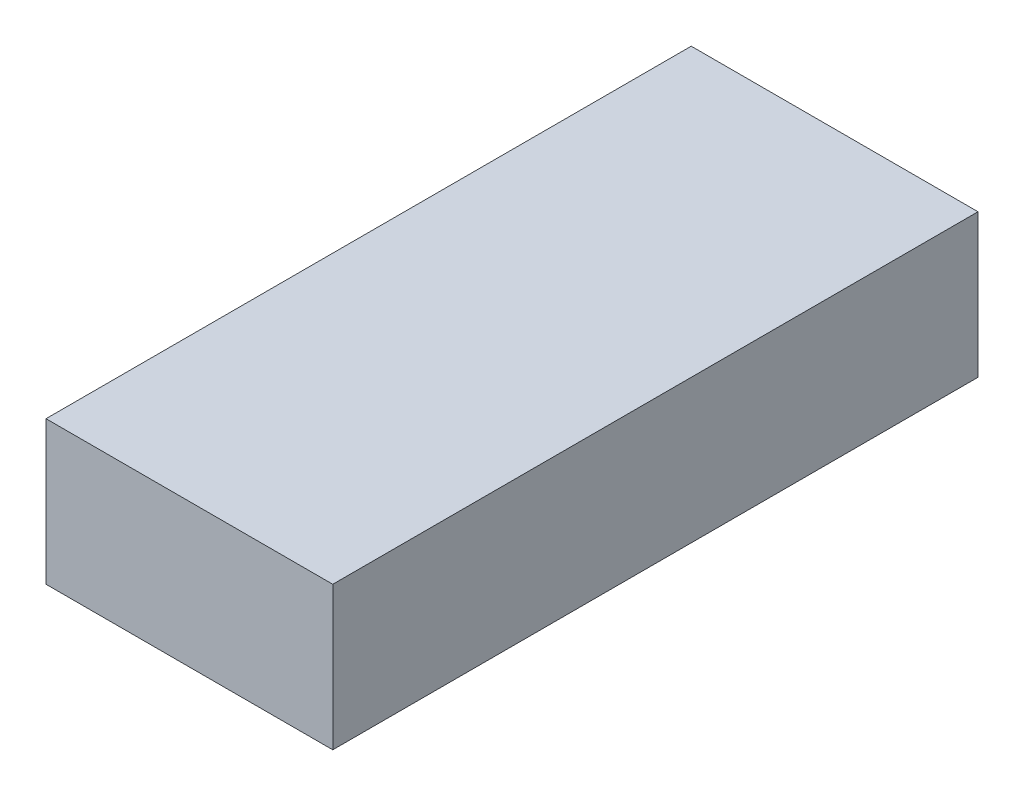
ISO-10303-21;
HEADER;
FILE_DESCRIPTION(('STEP AP214'),'2;1');
FILE_NAME('part.step','',(''),(''),'','','');
FILE_SCHEMA(('AUTOMOTIVE_DESIGN { 1 0 10303 214 1 1 1 1 }'));
ENDSEC;
DATA;
#1=APPLICATION_CONTEXT('core data for automotive mechanical design processes');
#2=APPLICATION_PROTOCOL_DEFINITION('international standard','automotive_design',2000,#1);
#3=PRODUCT_CONTEXT('',#1,'mechanical');
#4=PRODUCT('Part','Part','',(#3));
#5=PRODUCT_RELATED_PRODUCT_CATEGORY('part','',(#4));
#6=PRODUCT_DEFINITION_FORMATION('','',#4);
#7=PRODUCT_DEFINITION_CONTEXT('part definition',#1,'design');
#8=PRODUCT_DEFINITION('design','',#6,#7);
#9=PRODUCT_DEFINITION_SHAPE('','',#8);
#10=(LENGTH_UNIT() NAMED_UNIT(*) SI_UNIT(.MILLI.,.METRE.));
#11=(NAMED_UNIT(*) PLANE_ANGLE_UNIT() SI_UNIT($,.RADIAN.));
#12=(NAMED_UNIT(*) SI_UNIT($,.STERADIAN.) SOLID_ANGLE_UNIT());
#13=UNCERTAINTY_MEASURE_WITH_UNIT(LENGTH_MEASURE(1.E-05),#10,'distance_accuracy_value','');
#14=(GEOMETRIC_REPRESENTATION_CONTEXT(3) GLOBAL_UNCERTAINTY_ASSIGNED_CONTEXT((#13)) GLOBAL_UNIT_ASSIGNED_CONTEXT((#10,
#11,#12)) REPRESENTATION_CONTEXT('',''));
#15=CARTESIAN_POINT('',(0.,0.,0.));
#16=DIRECTION('',(0.,0.,1.));
#17=DIRECTION('',(1.,0.,0.));
#18=AXIS2_PLACEMENT_3D('',#15,#16,#17);
#19=CARTESIAN_POINT('',(-380.,10.,1700.));
#20=DIRECTION('',(0.,-1.,0.));
#21=DIRECTION('',(0.,0.,-1.));
#22=AXIS2_PLACEMENT_3D('',#19,#20,#21);
#23=PLANE('',#22);
#24=DIRECTION('',(0.,0.,-1.));
#25=VECTOR('',#24,1.);
#26=CARTESIAN_POINT('',(132.679491924311,10.,80.));
#27=LINE('',#26,#25);
#28=CARTESIAN_POINT('',(132.679491924311,9.99999999999999,0.));
#29=VERTEX_POINT('',#28);
#30=CARTESIAN_POINT('',(132.679491924311,10.,50.));
#31=VERTEX_POINT('',#30);
#32=EDGE_CURVE('E56',#29,#31,#27,.F.);
#33=ORIENTED_EDGE('',*,*,#32,.F.);
#34=DIRECTION('',(-1.,0.,0.));
#35=VECTOR('',#34,1.);
#36=CARTESIAN_POINT('',(-380.,10.,0.));
#37=LINE('',#36,#35);
#38=CARTESIAN_POINT('',(-132.679491924311,10.,0.));
#39=VERTEX_POINT('',#38);
#40=EDGE_CURVE('E192',#29,#39,#37,.T.);
#41=ORIENTED_EDGE('',*,*,#40,.T.);
#42=DIRECTION('',(0.,0.,-1.));
#43=VECTOR('',#42,1.);
#44=CARTESIAN_POINT('',(-132.679491924311,10.,80.));
#45=LINE('',#44,#43);
#46=CARTESIAN_POINT('',(-132.679491924311,10.,50.));
#47=VERTEX_POINT('',#46);
#48=EDGE_CURVE('E220',#47,#39,#45,.T.);
#49=ORIENTED_EDGE('',*,*,#48,.F.);
#50=DIRECTION('',(-1.,0.,0.));
#51=VECTOR('',#50,1.);
#52=CARTESIAN_POINT('',(0.,10.,50.));
#53=LINE('',#52,#51);
#54=EDGE_CURVE('E259',#31,#47,#53,.T.);
#55=ORIENTED_EDGE('',*,*,#54,.F.);
#56=EDGE_LOOP('',(#33,#41,#49,#55));
#57=FACE_BOUND('',#56,.T.);
#58=ADVANCED_FACE('F41',(#57),#23,.F.);
#59=DIRECTION('',(0.,0.,-1.));
#60=VECTOR('',#59,1.);
#61=CARTESIAN_POINT('',(167.320508075689,10.,80.));
#62=LINE('',#61,#60);
#63=CARTESIAN_POINT('',(167.320508075689,10.,50.));
#64=VERTEX_POINT('',#63);
#65=CARTESIAN_POINT('',(167.320508075689,9.99999999999999,0.));
#66=VERTEX_POINT('',#65);
#67=EDGE_CURVE('E176',#64,#66,#62,.T.);
#68=ORIENTED_EDGE('',*,*,#67,.F.);
#69=CARTESIAN_POINT('',(380.,9.99999999999995,50.));
#70=VERTEX_POINT('',#69);
#71=EDGE_CURVE('E260',#70,#64,#53,.T.);
#72=ORIENTED_EDGE('',*,*,#71,.F.);
#73=DIRECTION('',(0.,0.,-1.));
#74=VECTOR('',#73,1.);
#75=CARTESIAN_POINT('',(380.,10.,1700.));
#76=LINE('',#75,#74);
#77=CARTESIAN_POINT('',(380.,9.99999999999995,0.));
#78=VERTEX_POINT('',#77);
#79=EDGE_CURVE('E199',#70,#78,#76,.T.);
#80=ORIENTED_EDGE('',*,*,#79,.T.);
#81=EDGE_CURVE('E189',#78,#66,#37,.T.);
#82=ORIENTED_EDGE('',*,*,#81,.T.);
#83=EDGE_LOOP('',(#68,#72,#80,#82));
#84=FACE_BOUND('',#83,.T.);
#85=ADVANCED_FACE('F197',(#84),#23,.F.);
#86=CARTESIAN_POINT('',(-380.,-10.,1700.));
#87=DIRECTION('',(0.,1.,0.));
#88=DIRECTION('',(0.,0.,1.));
#89=AXIS2_PLACEMENT_3D('',#86,#87,#88);
#90=PLANE('',#89);
#91=DIRECTION('',(0.,0.,-1.));
#92=VECTOR('',#91,1.);
#93=CARTESIAN_POINT('',(167.320508075689,-10.,80.));
#94=LINE('',#93,#92);
#95=CARTESIAN_POINT('',(167.320508075689,-9.99999999999999,0.));
#96=VERTEX_POINT('',#95);
#97=CARTESIAN_POINT('',(167.320508075689,-10.,50.));
#98=VERTEX_POINT('',#97);
#99=EDGE_CURVE('E64',#96,#98,#94,.F.);
#100=ORIENTED_EDGE('',*,*,#99,.F.);
#101=DIRECTION('',(1.,0.,0.));
#102=VECTOR('',#101,1.);
#103=CARTESIAN_POINT('',(-380.,-10.,0.));
#104=LINE('',#103,#102);
#105=CARTESIAN_POINT('',(380.,-10.0000000000001,0.));
#106=VERTEX_POINT('',#105);
#107=EDGE_CURVE('E200',#96,#106,#104,.T.);
#108=ORIENTED_EDGE('',*,*,#107,.T.);
#109=DIRECTION('',(0.,0.,-1.));
#110=VECTOR('',#109,1.);
#111=CARTESIAN_POINT('',(380.,-10.,1700.));
#112=LINE('',#111,#110);
#113=CARTESIAN_POINT('',(380.,-10.0000000000001,50.));
#114=VERTEX_POINT('',#113);
#115=EDGE_CURVE('E211',#114,#106,#112,.T.);
#116=ORIENTED_EDGE('',*,*,#115,.F.);
#117=DIRECTION('',(1.,0.,0.));
#118=VECTOR('',#117,1.);
#119=CARTESIAN_POINT('',(0.,-10.,50.));
#120=LINE('',#119,#118);
#121=EDGE_CURVE('E239',#98,#114,#120,.T.);
#122=ORIENTED_EDGE('',*,*,#121,.F.);
#123=EDGE_LOOP('',(#100,#108,#116,#122));
#124=FACE_BOUND('',#123,.T.);
#125=ADVANCED_FACE('F246',(#124),#90,.F.);
#126=DIRECTION('',(0.,0.,-1.));
#127=VECTOR('',#126,1.);
#128=CARTESIAN_POINT('',(132.679491924311,-10.,80.));
#129=LINE('',#128,#127);
#130=CARTESIAN_POINT('',(132.679491924311,-10.,50.));
#131=VERTEX_POINT('',#130);
#132=CARTESIAN_POINT('',(132.679491924311,-9.99999999999999,0.));
#133=VERTEX_POINT('',#132);
#134=EDGE_CURVE('E232',#131,#133,#129,.T.);
#135=ORIENTED_EDGE('',*,*,#134,.F.);
#136=CARTESIAN_POINT('',(-132.679491924311,-10.,50.));
#137=VERTEX_POINT('',#136);
#138=EDGE_CURVE('E242',#137,#131,#120,.T.);
#139=ORIENTED_EDGE('',*,*,#138,.F.);
#140=DIRECTION('',(0.,0.,-1.));
#141=VECTOR('',#140,1.);
#142=CARTESIAN_POINT('',(-132.679491924311,-10.,80.));
#143=LINE('',#142,#141);
#144=CARTESIAN_POINT('',(-132.679491924311,-10.,0.));
#145=VERTEX_POINT('',#144);
#146=EDGE_CURVE('E11',#145,#137,#143,.F.);
#147=ORIENTED_EDGE('',*,*,#146,.F.);
#148=EDGE_CURVE('E203',#145,#133,#104,.T.);
#149=ORIENTED_EDGE('',*,*,#148,.T.);
#150=EDGE_LOOP('',(#135,#139,#147,#149));
#151=FACE_BOUND('',#150,.T.);
#152=ADVANCED_FACE('F278',(#151),#90,.F.);
#153=DIRECTION('',(0.,0.,-1.));
#154=VECTOR('',#153,1.);
#155=CARTESIAN_POINT('',(-167.320508075689,10.,80.));
#156=LINE('',#155,#154);
#157=CARTESIAN_POINT('',(-167.320508075689,10.,0.));
#158=VERTEX_POINT('',#157);
#159=CARTESIAN_POINT('',(-167.320508075689,10.,50.));
#160=VERTEX_POINT('',#159);
#161=EDGE_CURVE('E213',#158,#160,#156,.F.);
#162=ORIENTED_EDGE('',*,*,#161,.F.);
#163=CARTESIAN_POINT('',(-380.,10.,0.));
#164=VERTEX_POINT('',#163);
#165=EDGE_CURVE('E202',#158,#164,#37,.T.);
#166=ORIENTED_EDGE('',*,*,#165,.T.);
#167=DIRECTION('',(0.,0.,-1.));
#168=VECTOR('',#167,1.);
#169=CARTESIAN_POINT('',(-380.,10.,1700.));
#170=LINE('',#169,#168);
#171=CARTESIAN_POINT('',(-380.,10.,50.));
#172=VERTEX_POINT('',#171);
#173=EDGE_CURVE('E584',#172,#164,#170,.T.);
#174=ORIENTED_EDGE('',*,*,#173,.F.);
#175=EDGE_CURVE('E256',#160,#172,#53,.T.);
#176=ORIENTED_EDGE('',*,*,#175,.F.);
#177=EDGE_LOOP('',(#162,#166,#174,#176));
#178=FACE_BOUND('',#177,.T.);
#179=ADVANCED_FACE('F293',(#178),#23,.F.);
#180=DIRECTION('',(0.,0.,-1.));
#181=VECTOR('',#180,1.);
#182=CARTESIAN_POINT('',(-167.320508075689,-10.,80.));
#183=LINE('',#182,#181);
#184=CARTESIAN_POINT('',(-167.320508075689,-10.,50.));
#185=VERTEX_POINT('',#184);
#186=CARTESIAN_POINT('',(-167.320508075689,-10.,0.));
#187=VERTEX_POINT('',#186);
#188=EDGE_CURVE('E49',#185,#187,#183,.T.);
#189=ORIENTED_EDGE('',*,*,#188,.F.);
#190=CARTESIAN_POINT('',(-380.,-10.,50.));
#191=VERTEX_POINT('',#190);
#192=EDGE_CURVE('E250',#191,#185,#120,.T.);
#193=ORIENTED_EDGE('',*,*,#192,.F.);
#194=DIRECTION('',(0.,0.,-1.));
#195=VECTOR('',#194,1.);
#196=CARTESIAN_POINT('',(-380.,-10.,1700.));
#197=LINE('',#196,#195);
#198=CARTESIAN_POINT('',(-380.,-10.,0.));
#199=VERTEX_POINT('',#198);
#200=EDGE_CURVE('E571',#191,#199,#197,.T.);
#201=ORIENTED_EDGE('',*,*,#200,.T.);
#202=EDGE_CURVE('E205',#199,#187,#104,.T.);
#203=ORIENTED_EDGE('',*,*,#202,.T.);
#204=EDGE_LOOP('',(#189,#193,#201,#203));
#205=FACE_BOUND('',#204,.T.);
#206=ADVANCED_FACE('F300',(#205),#90,.F.);
#207=CARTESIAN_POINT('',(0.,0.,50.));
#208=DIRECTION('',(0.,0.,-1.));
#209=DIRECTION('',(-1.,0.,0.));
#210=AXIS2_PLACEMENT_3D('',#207,#208,#209);
#211=PLANE('',#210);
#212=ORIENTED_EDGE('',*,*,#71,.T.);
#213=CARTESIAN_POINT('',(150.,0.,50.));
#214=DIRECTION('',(0.,0.,-1.));
#215=DIRECTION('',(-1.,0.,0.));
#216=AXIS2_PLACEMENT_3D('',#213,#214,#215);
#217=CIRCLE('',#216,20.);
#218=EDGE_CURVE('E180',#64,#31,#217,.F.);
#219=ORIENTED_EDGE('',*,*,#218,.T.);
#220=ORIENTED_EDGE('',*,*,#54,.T.);
#221=CARTESIAN_POINT('',(-150.,0.,50.));
#222=DIRECTION('',(0.,0.,-1.));
#223=DIRECTION('',(-1.,0.,0.));
#224=AXIS2_PLACEMENT_3D('',#221,#222,#223);
#225=CIRCLE('',#224,20.);
#226=EDGE_CURVE('E218',#47,#160,#225,.F.);
#227=ORIENTED_EDGE('',*,*,#226,.T.);
#228=ORIENTED_EDGE('',*,*,#175,.T.);
#229=DIRECTION('',(0.,-1.,0.));
#230=VECTOR('',#229,1.);
#231=CARTESIAN_POINT('',(-380.,-180.,50.));
#232=LINE('',#231,#230);
#233=CARTESIAN_POINT('',(-380.,180.,50.));
#234=VERTEX_POINT('',#233);
#235=EDGE_CURVE('E587',#234,#172,#232,.T.);
#236=ORIENTED_EDGE('',*,*,#235,.F.);
#237=DIRECTION('',(-1.,0.,0.));
#238=VECTOR('',#237,1.);
#239=CARTESIAN_POINT('',(-380.,180.,50.));
#240=LINE('',#239,#238);
#241=CARTESIAN_POINT('',(380.,180.,50.));
#242=VERTEX_POINT('',#241);
#243=EDGE_CURVE('E579',#242,#234,#240,.T.);
#244=ORIENTED_EDGE('',*,*,#243,.F.);
#245=DIRECTION('',(0.,1.,0.));
#246=VECTOR('',#245,1.);
#247=CARTESIAN_POINT('',(380.,-180.,50.));
#248=LINE('',#247,#246);
#249=EDGE_CURVE('E321',#70,#242,#248,.T.);
#250=ORIENTED_EDGE('',*,*,#249,.F.);
#251=EDGE_LOOP('',(#212,#219,#220,#227,#228,#236,#244,#250));
#252=FACE_BOUND('',#251,.T.);
#253=ADVANCED_FACE('F305',(#252),#211,.T.);
#254=ORIENTED_EDGE('',*,*,#138,.T.);
#255=CARTESIAN_POINT('',(150.,0.,50.));
#256=DIRECTION('',(0.,0.,-1.));
#257=DIRECTION('',(-1.,0.,0.));
#258=AXIS2_PLACEMENT_3D('',#255,#256,#257);
#259=CIRCLE('',#258,20.);
#260=EDGE_CURVE('E193',#131,#98,#259,.F.);
#261=ORIENTED_EDGE('',*,*,#260,.T.);
#262=ORIENTED_EDGE('',*,*,#121,.T.);
#263=CARTESIAN_POINT('',(380.,-180.,50.));
#264=VERTEX_POINT('',#263);
#265=EDGE_CURVE('E578',#264,#114,#248,.T.);
#266=ORIENTED_EDGE('',*,*,#265,.F.);
#267=DIRECTION('',(1.,0.,0.));
#268=VECTOR('',#267,1.);
#269=CARTESIAN_POINT('',(-380.,-180.,50.));
#270=LINE('',#269,#268);
#271=CARTESIAN_POINT('',(-380.,-180.,50.));
#272=VERTEX_POINT('',#271);
#273=EDGE_CURVE('E330',#272,#264,#270,.T.);
#274=ORIENTED_EDGE('',*,*,#273,.F.);
#275=EDGE_CURVE('E581',#191,#272,#232,.T.);
#276=ORIENTED_EDGE('',*,*,#275,.F.);
#277=ORIENTED_EDGE('',*,*,#192,.T.);
#278=CARTESIAN_POINT('',(-150.,0.,50.));
#279=DIRECTION('',(0.,0.,-1.));
#280=DIRECTION('',(-1.,0.,0.));
#281=AXIS2_PLACEMENT_3D('',#278,#279,#280);
#282=CIRCLE('',#281,20.);
#283=EDGE_CURVE('E223',#185,#137,#282,.F.);
#284=ORIENTED_EDGE('',*,*,#283,.T.);
#285=EDGE_LOOP('',(#254,#261,#262,#266,#274,#276,#277,#284));
#286=FACE_BOUND('',#285,.T.);
#287=ADVANCED_FACE('F237',(#286),#211,.T.);
#288=CARTESIAN_POINT('',(380.,-180.,50.));
#289=DIRECTION('',(-1.,0.,0.));
#290=DIRECTION('',(0.,0.,1.));
#291=AXIS2_PLACEMENT_3D('',#288,#289,#290);
#292=PLANE('',#291);
#293=DIRECTION('',(0.,1.,0.));
#294=VECTOR('',#293,1.);
#295=CARTESIAN_POINT('',(380.,-180.,0.));
#296=LINE('',#295,#294);
#297=CARTESIAN_POINT('',(380.,180.,0.));
#298=VERTEX_POINT('',#297);
#299=EDGE_CURVE('E590',#78,#298,#296,.T.);
#300=ORIENTED_EDGE('',*,*,#299,.F.);
#301=ORIENTED_EDGE('',*,*,#79,.F.);
#302=ORIENTED_EDGE('',*,*,#249,.T.);
#303=DIRECTION('',(0.,0.,-1.));
#304=VECTOR('',#303,1.);
#305=CARTESIAN_POINT('',(380.,180.,50.));
#306=LINE('',#305,#304);
#307=EDGE_CURVE('E335',#242,#298,#306,.T.);
#308=ORIENTED_EDGE('',*,*,#307,.T.);
#309=EDGE_LOOP('',(#300,#301,#302,#308));
#310=FACE_BOUND('',#309,.T.);
#311=ADVANCED_FACE('F396',(#310),#292,.T.);
#312=ORIENTED_EDGE('',*,*,#265,.T.);
#313=ORIENTED_EDGE('',*,*,#115,.T.);
#314=CARTESIAN_POINT('',(380.,-180.,0.));
#315=VERTEX_POINT('',#314);
#316=EDGE_CURVE('E575',#315,#106,#296,.T.);
#317=ORIENTED_EDGE('',*,*,#316,.F.);
#318=DIRECTION('',(0.,0.,-1.));
#319=VECTOR('',#318,1.);
#320=CARTESIAN_POINT('',(380.,-180.,50.));
#321=LINE('',#320,#319);
#322=EDGE_CURVE('E326',#264,#315,#321,.T.);
#323=ORIENTED_EDGE('',*,*,#322,.F.);
#324=EDGE_LOOP('',(#312,#313,#317,#323));
#325=FACE_BOUND('',#324,.T.);
#326=ADVANCED_FACE('F399',(#325),#292,.T.);
#327=CARTESIAN_POINT('',(-380.,-180.,50.));
#328=DIRECTION('',(1.,0.,0.));
#329=DIRECTION('',(0.,0.,-1.));
#330=AXIS2_PLACEMENT_3D('',#327,#328,#329);
#331=PLANE('',#330);
#332=ORIENTED_EDGE('',*,*,#235,.T.);
#333=ORIENTED_EDGE('',*,*,#173,.T.);
#334=DIRECTION('',(0.,-1.,0.));
#335=VECTOR('',#334,1.);
#336=CARTESIAN_POINT('',(-380.,-180.,0.));
#337=LINE('',#336,#335);
#338=CARTESIAN_POINT('',(-380.,180.,0.));
#339=VERTEX_POINT('',#338);
#340=EDGE_CURVE('E312',#339,#164,#337,.T.);
#341=ORIENTED_EDGE('',*,*,#340,.F.);
#342=DIRECTION('',(0.,0.,-1.));
#343=VECTOR('',#342,1.);
#344=CARTESIAN_POINT('',(-380.,180.,50.));
#345=LINE('',#344,#343);
#346=EDGE_CURVE('E333',#234,#339,#345,.T.);
#347=ORIENTED_EDGE('',*,*,#346,.F.);
#348=EDGE_LOOP('',(#332,#333,#341,#347));
#349=FACE_BOUND('',#348,.T.);
#350=ADVANCED_FACE('F405',(#349),#331,.T.);
#351=CARTESIAN_POINT('',(-380.,-180.,0.));
#352=VERTEX_POINT('',#351);
#353=EDGE_CURVE('E318',#199,#352,#337,.T.);
#354=ORIENTED_EDGE('',*,*,#353,.F.);
#355=ORIENTED_EDGE('',*,*,#200,.F.);
#356=ORIENTED_EDGE('',*,*,#275,.T.);
#357=DIRECTION('',(0.,0.,-1.));
#358=VECTOR('',#357,1.);
#359=CARTESIAN_POINT('',(-380.,-180.,50.));
#360=LINE('',#359,#358);
#361=EDGE_CURVE('E329',#272,#352,#360,.T.);
#362=ORIENTED_EDGE('',*,*,#361,.T.);
#363=EDGE_LOOP('',(#354,#355,#356,#362));
#364=FACE_BOUND('',#363,.T.);
#365=ADVANCED_FACE('F392',(#364),#331,.T.);
#366=CARTESIAN_POINT('',(0.,0.,0.));
#367=DIRECTION('',(0.,0.,-1.));
#368=DIRECTION('',(-1.,0.,0.));
#369=AXIS2_PLACEMENT_3D('',#366,#367,#368);
#370=PLANE('',#369);
#371=ORIENTED_EDGE('',*,*,#40,.F.);
#372=CARTESIAN_POINT('',(150.,0.,0.));
#373=DIRECTION('',(0.,0.,1.));
#374=DIRECTION('',(1.,0.,0.));
#375=AXIS2_PLACEMENT_3D('',#372,#373,#374);
#376=CIRCLE('',#375,20.);
#377=EDGE_CURVE('E179',#66,#29,#376,.T.);
#378=ORIENTED_EDGE('',*,*,#377,.F.);
#379=ORIENTED_EDGE('',*,*,#81,.F.);
#380=ORIENTED_EDGE('',*,*,#299,.T.);
#381=DIRECTION('',(-1.,0.,0.));
#382=VECTOR('',#381,1.);
#383=CARTESIAN_POINT('',(-380.,180.,0.));
#384=LINE('',#383,#382);
#385=EDGE_CURVE('E314',#298,#339,#384,.T.);
#386=ORIENTED_EDGE('',*,*,#385,.T.);
#387=ORIENTED_EDGE('',*,*,#340,.T.);
#388=ORIENTED_EDGE('',*,*,#165,.F.);
#389=CARTESIAN_POINT('',(-150.,0.,0.));
#390=DIRECTION('',(0.,0.,1.));
#391=DIRECTION('',(1.,0.,0.));
#392=AXIS2_PLACEMENT_3D('',#389,#390,#391);
#393=CIRCLE('',#392,20.);
#394=EDGE_CURVE('E225',#39,#158,#393,.T.);
#395=ORIENTED_EDGE('',*,*,#394,.F.);
#396=EDGE_LOOP('',(#371,#378,#379,#380,#386,#387,#388,#395));
#397=FACE_BOUND('',#396,.T.);
#398=ORIENTED_EDGE('',*,*,#107,.F.);
#399=EDGE_CURVE('E194',#133,#96,#376,.T.);
#400=ORIENTED_EDGE('',*,*,#399,.F.);
#401=ORIENTED_EDGE('',*,*,#148,.F.);
#402=EDGE_CURVE('E228',#187,#145,#393,.T.);
#403=ORIENTED_EDGE('',*,*,#402,.F.);
#404=ORIENTED_EDGE('',*,*,#202,.F.);
#405=ORIENTED_EDGE('',*,*,#353,.T.);
#406=DIRECTION('',(1.,0.,0.));
#407=VECTOR('',#406,1.);
#408=CARTESIAN_POINT('',(-380.,-180.,0.));
#409=LINE('',#408,#407);
#410=EDGE_CURVE('E317',#352,#315,#409,.T.);
#411=ORIENTED_EDGE('',*,*,#410,.T.);
#412=ORIENTED_EDGE('',*,*,#316,.T.);
#413=EDGE_LOOP('',(#398,#400,#401,#403,#404,#405,#411,#412));
#414=FACE_BOUND('',#413,.T.);
#415=DIRECTION('',(0.,1.,0.));
#416=VECTOR('',#415,1.);
#417=CARTESIAN_POINT('',(400.,-200.,0.));
#418=LINE('',#417,#416);
#419=CARTESIAN_POINT('',(400.,-200.,0.));
#420=VERTEX_POINT('',#419);
#421=CARTESIAN_POINT('',(400.,200.,0.));
#422=VERTEX_POINT('',#421);
#423=EDGE_CURVE('E338',#420,#422,#418,.T.);
#424=ORIENTED_EDGE('',*,*,#423,.F.);
#425=DIRECTION('',(1.,0.,0.));
#426=VECTOR('',#425,1.);
#427=CARTESIAN_POINT('',(-400.,-200.,0.));
#428=LINE('',#427,#426);
#429=CARTESIAN_POINT('',(-400.,-200.,0.));
#430=VERTEX_POINT('',#429);
#431=EDGE_CURVE('E343',#430,#420,#428,.T.);
#432=ORIENTED_EDGE('',*,*,#431,.F.);
#433=DIRECTION('',(0.,-1.,0.));
#434=VECTOR('',#433,1.);
#435=CARTESIAN_POINT('',(-400.,-200.,0.));
#436=LINE('',#435,#434);
#437=CARTESIAN_POINT('',(-400.,200.,0.));
#438=VERTEX_POINT('',#437);
#439=EDGE_CURVE('E354',#438,#430,#436,.T.);
#440=ORIENTED_EDGE('',*,*,#439,.F.);
#441=DIRECTION('',(-1.,0.,0.));
#442=VECTOR('',#441,1.);
#443=CARTESIAN_POINT('',(-400.,200.,0.));
#444=LINE('',#443,#442);
#445=EDGE_CURVE('E352',#422,#438,#444,.T.);
#446=ORIENTED_EDGE('',*,*,#445,.F.);
#447=EDGE_LOOP('',(#424,#432,#440,#446));
#448=FACE_BOUND('',#447,.T.);
#449=ADVANCED_FACE('F187',(#397,#414,#448),#370,.T.);
#450=CARTESIAN_POINT('',(400.,-200.,1800.));
#451=DIRECTION('',(-1.,0.,0.));
#452=DIRECTION('',(0.,0.,1.));
#453=AXIS2_PLACEMENT_3D('',#450,#451,#452);
#454=PLANE('',#453);
#455=ORIENTED_EDGE('',*,*,#423,.T.);
#456=DIRECTION('',(0.,0.,-1.));
#457=VECTOR('',#456,1.);
#458=CARTESIAN_POINT('',(400.,200.,1800.));
#459=LINE('',#458,#457);
#460=CARTESIAN_POINT('',(400.,200.,1800.));
#461=VERTEX_POINT('',#460);
#462=EDGE_CURVE('E248',#461,#422,#459,.T.);
#463=ORIENTED_EDGE('',*,*,#462,.F.);
#464=DIRECTION('',(0.,1.,0.));
#465=VECTOR('',#464,1.);
#466=CARTESIAN_POINT('',(400.,-200.,1800.));
#467=LINE('',#466,#465);
#468=CARTESIAN_POINT('',(400.,-200.,1800.));
#469=VERTEX_POINT('',#468);
#470=EDGE_CURVE('E339',#469,#461,#467,.T.);
#471=ORIENTED_EDGE('',*,*,#470,.F.);
#472=DIRECTION('',(0.,0.,-1.));
#473=VECTOR('',#472,1.);
#474=CARTESIAN_POINT('',(400.,-200.,1800.));
#475=LINE('',#474,#473);
#476=EDGE_CURVE('E349',#469,#420,#475,.T.);
#477=ORIENTED_EDGE('',*,*,#476,.T.);
#478=EDGE_LOOP('',(#455,#463,#471,#477));
#479=FACE_BOUND('',#478,.T.);
#480=ADVANCED_FACE('F43',(#479),#454,.F.);
#481=CARTESIAN_POINT('',(-400.,200.,1800.));
#482=DIRECTION('',(0.,-1.,0.));
#483=DIRECTION('',(0.,0.,-1.));
#484=AXIS2_PLACEMENT_3D('',#481,#482,#483);
#485=PLANE('',#484);
#486=ORIENTED_EDGE('',*,*,#445,.T.);
#487=DIRECTION('',(0.,0.,-1.));
#488=VECTOR('',#487,1.);
#489=CARTESIAN_POINT('',(-400.,200.,1800.));
#490=LINE('',#489,#488);
#491=CARTESIAN_POINT('',(-400.,200.,1800.));
#492=VERTEX_POINT('',#491);
#493=EDGE_CURVE('E252',#492,#438,#490,.T.);
#494=ORIENTED_EDGE('',*,*,#493,.F.);
#495=DIRECTION('',(-1.,0.,0.));
#496=VECTOR('',#495,1.);
#497=CARTESIAN_POINT('',(-400.,200.,1800.));
#498=LINE('',#497,#496);
#499=EDGE_CURVE('E342',#461,#492,#498,.T.);
#500=ORIENTED_EDGE('',*,*,#499,.F.);
#501=ORIENTED_EDGE('',*,*,#462,.T.);
#502=EDGE_LOOP('',(#486,#494,#500,#501));
#503=FACE_BOUND('',#502,.T.);
#504=ADVANCED_FACE('F381',(#503),#485,.F.);
#505=CARTESIAN_POINT('',(-400.,-200.,1800.));
#506=DIRECTION('',(1.,0.,0.));
#507=DIRECTION('',(0.,0.,-1.));
#508=AXIS2_PLACEMENT_3D('',#505,#506,#507);
#509=PLANE('',#508);
#510=ORIENTED_EDGE('',*,*,#439,.T.);
#511=DIRECTION('',(0.,0.,-1.));
#512=VECTOR('',#511,1.);
#513=CARTESIAN_POINT('',(-400.,-200.,1800.));
#514=LINE('',#513,#512);
#515=CARTESIAN_POINT('',(-400.,-200.,1800.));
#516=VERTEX_POINT('',#515);
#517=EDGE_CURVE('E359',#516,#430,#514,.T.);
#518=ORIENTED_EDGE('',*,*,#517,.F.);
#519=DIRECTION('',(0.,-1.,0.));
#520=VECTOR('',#519,1.);
#521=CARTESIAN_POINT('',(-400.,-200.,1800.));
#522=LINE('',#521,#520);
#523=EDGE_CURVE('E345',#492,#516,#522,.T.);
#524=ORIENTED_EDGE('',*,*,#523,.F.);
#525=ORIENTED_EDGE('',*,*,#493,.T.);
#526=EDGE_LOOP('',(#510,#518,#524,#525));
#527=FACE_BOUND('',#526,.T.);
#528=ADVANCED_FACE('F367',(#527),#509,.F.);
#529=CARTESIAN_POINT('',(-400.,-200.,1800.));
#530=DIRECTION('',(0.,1.,0.));
#531=DIRECTION('',(0.,0.,1.));
#532=AXIS2_PLACEMENT_3D('',#529,#530,#531);
#533=PLANE('',#532);
#534=ORIENTED_EDGE('',*,*,#431,.T.);
#535=ORIENTED_EDGE('',*,*,#476,.F.);
#536=DIRECTION('',(1.,0.,0.));
#537=VECTOR('',#536,1.);
#538=CARTESIAN_POINT('',(-400.,-200.,1800.));
#539=LINE('',#538,#537);
#540=EDGE_CURVE('E347',#516,#469,#539,.T.);
#541=ORIENTED_EDGE('',*,*,#540,.F.);
#542=ORIENTED_EDGE('',*,*,#517,.T.);
#543=EDGE_LOOP('',(#534,#535,#541,#542));
#544=FACE_BOUND('',#543,.T.);
#545=ADVANCED_FACE('F374',(#544),#533,.F.);
#546=CARTESIAN_POINT('',(0.,0.,1800.));
#547=DIRECTION('',(0.,0.,-1.));
#548=DIRECTION('',(-1.,0.,0.));
#549=AXIS2_PLACEMENT_3D('',#546,#547,#548);
#550=PLANE('',#549);
#551=ORIENTED_EDGE('',*,*,#470,.T.);
#552=ORIENTED_EDGE('',*,*,#499,.T.);
#553=ORIENTED_EDGE('',*,*,#523,.T.);
#554=ORIENTED_EDGE('',*,*,#540,.T.);
#555=EDGE_LOOP('',(#551,#552,#553,#554));
#556=FACE_BOUND('',#555,.T.);
#557=ADVANCED_FACE('F380',(#556),#550,.F.);
#558=CARTESIAN_POINT('',(-380.,180.,50.));
#559=DIRECTION('',(0.,-1.,0.));
#560=DIRECTION('',(0.,0.,-1.));
#561=AXIS2_PLACEMENT_3D('',#558,#559,#560);
#562=PLANE('',#561);
#563=ORIENTED_EDGE('',*,*,#385,.F.);
#564=ORIENTED_EDGE('',*,*,#307,.F.);
#565=ORIENTED_EDGE('',*,*,#243,.T.);
#566=ORIENTED_EDGE('',*,*,#346,.T.);
#567=EDGE_LOOP('',(#563,#564,#565,#566));
#568=FACE_BOUND('',#567,.T.);
#569=ADVANCED_FACE('F395',(#568),#562,.T.);
#570=CARTESIAN_POINT('',(-380.,-180.,50.));
#571=DIRECTION('',(0.,1.,0.));
#572=DIRECTION('',(0.,0.,1.));
#573=AXIS2_PLACEMENT_3D('',#570,#571,#572);
#574=PLANE('',#573);
#575=ORIENTED_EDGE('',*,*,#410,.F.);
#576=ORIENTED_EDGE('',*,*,#361,.F.);
#577=ORIENTED_EDGE('',*,*,#273,.T.);
#578=ORIENTED_EDGE('',*,*,#322,.T.);
#579=EDGE_LOOP('',(#575,#576,#577,#578));
#580=FACE_BOUND('',#579,.T.);
#581=ADVANCED_FACE('F403',(#580),#574,.T.);
#582=CARTESIAN_POINT('',(-150.,0.,80.));
#583=DIRECTION('',(0.,0.,-1.));
#584=DIRECTION('',(-1.,0.,0.));
#585=AXIS2_PLACEMENT_3D('',#582,#583,#584);
#586=CYLINDRICAL_SURFACE('',#585,20.);
#587=ORIENTED_EDGE('',*,*,#402,.T.);
#588=ORIENTED_EDGE('',*,*,#146,.T.);
#589=ORIENTED_EDGE('',*,*,#283,.F.);
#590=ORIENTED_EDGE('',*,*,#188,.T.);
#591=EDGE_LOOP('',(#587,#588,#589,#590));
#592=FACE_BOUND('',#591,.T.);
#593=ADVANCED_FACE('F269',(#592),#586,.T.);
#594=ORIENTED_EDGE('',*,*,#394,.T.);
#595=ORIENTED_EDGE('',*,*,#161,.T.);
#596=ORIENTED_EDGE('',*,*,#226,.F.);
#597=ORIENTED_EDGE('',*,*,#48,.T.);
#598=EDGE_LOOP('',(#594,#595,#596,#597));
#599=FACE_BOUND('',#598,.T.);
#600=ADVANCED_FACE('F281',(#599),#586,.T.);
#601=CARTESIAN_POINT('',(150.,0.,80.));
#602=DIRECTION('',(0.,0.,-1.));
#603=DIRECTION('',(-1.,0.,0.));
#604=AXIS2_PLACEMENT_3D('',#601,#602,#603);
#605=CYLINDRICAL_SURFACE('',#604,20.);
#606=ORIENTED_EDGE('',*,*,#399,.T.);
#607=ORIENTED_EDGE('',*,*,#99,.T.);
#608=ORIENTED_EDGE('',*,*,#260,.F.);
#609=ORIENTED_EDGE('',*,*,#134,.T.);
#610=EDGE_LOOP('',(#606,#607,#608,#609));
#611=FACE_BOUND('',#610,.T.);
#612=ADVANCED_FACE('F279',(#611),#605,.T.);
#613=ORIENTED_EDGE('',*,*,#377,.T.);
#614=ORIENTED_EDGE('',*,*,#32,.T.);
#615=ORIENTED_EDGE('',*,*,#218,.F.);
#616=ORIENTED_EDGE('',*,*,#67,.T.);
#617=EDGE_LOOP('',(#613,#614,#615,#616));
#618=FACE_BOUND('',#617,.T.);
#619=ADVANCED_FACE('F178',(#618),#605,.T.);
#620=CLOSED_SHELL('',(#58,#85,#125,#152,#179,#206,#253,#287,#311,#326,#350,#365,#449,#480,#504,
#528,#545,#557,#569,#581,#593,#600,#612,#619));
#621=MANIFOLD_SOLID_BREP('B2',#620);
#622=ADVANCED_BREP_SHAPE_REPRESENTATION('',(#18,#621),#14);
#623=SHAPE_DEFINITION_REPRESENTATION(#9,#622);
ENDSEC;
END-ISO-10303-21;
